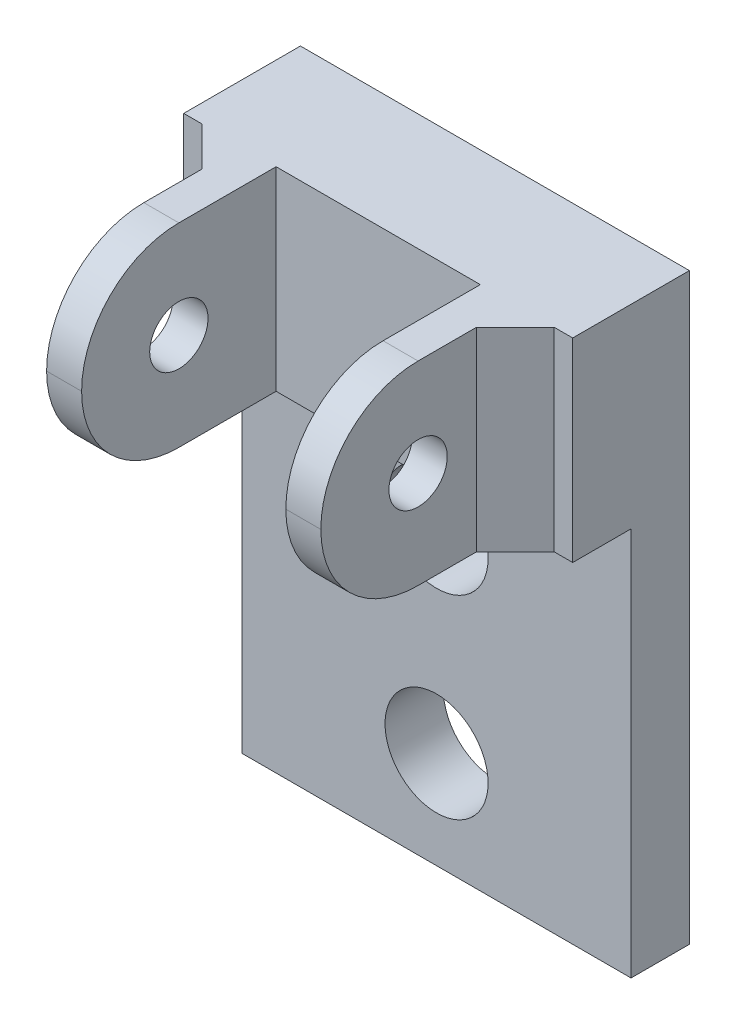
ISO-10303-21;
HEADER;
FILE_DESCRIPTION(('STEP AP214'),'2;1');
FILE_NAME('part.step','',(''),(''),'','','');
FILE_SCHEMA(('AUTOMOTIVE_DESIGN { 1 0 10303 214 1 1 1 1 }'));
ENDSEC;
DATA;
#1=APPLICATION_CONTEXT('core data for automotive mechanical design processes');
#2=APPLICATION_PROTOCOL_DEFINITION('international standard','automotive_design',2000,#1);
#3=PRODUCT_CONTEXT('',#1,'mechanical');
#4=PRODUCT('Part','Part','',(#3));
#5=PRODUCT_RELATED_PRODUCT_CATEGORY('part','',(#4));
#6=PRODUCT_DEFINITION_FORMATION('','',#4);
#7=PRODUCT_DEFINITION_CONTEXT('part definition',#1,'design');
#8=PRODUCT_DEFINITION('design','',#6,#7);
#9=PRODUCT_DEFINITION_SHAPE('','',#8);
#10=(LENGTH_UNIT() NAMED_UNIT(*) SI_UNIT(.MILLI.,.METRE.));
#11=(NAMED_UNIT(*) PLANE_ANGLE_UNIT() SI_UNIT($,.RADIAN.));
#12=(NAMED_UNIT(*) SI_UNIT($,.STERADIAN.) SOLID_ANGLE_UNIT());
#13=UNCERTAINTY_MEASURE_WITH_UNIT(LENGTH_MEASURE(1.E-05),#10,'distance_accuracy_value','');
#14=(GEOMETRIC_REPRESENTATION_CONTEXT(3) GLOBAL_UNCERTAINTY_ASSIGNED_CONTEXT((#13)) GLOBAL_UNIT_ASSIGNED_CONTEXT((#10,
#11,#12)) REPRESENTATION_CONTEXT('',''));
#15=CARTESIAN_POINT('',(0.,0.,0.));
#16=DIRECTION('',(0.,0.,1.));
#17=DIRECTION('',(1.,0.,0.));
#18=AXIS2_PLACEMENT_3D('',#15,#16,#17);
#19=CARTESIAN_POINT('',(0.,0.,6.));
#20=DIRECTION('',(0.,0.,1.));
#21=DIRECTION('',(1.,0.,0.));
#22=AXIS2_PLACEMENT_3D('',#19,#20,#21);
#23=PLANE('',#22);
#24=DIRECTION('',(1.,0.,0.));
#25=VECTOR('',#24,1.);
#26=CARTESIAN_POINT('',(-10.,5.,6.));
#27=LINE('',#26,#25);
#28=CARTESIAN_POINT('',(-5.25,5.,6.));
#29=VERTEX_POINT('',#28);
#30=CARTESIAN_POINT('',(5.25,5.,6.));
#31=VERTEX_POINT('',#30);
#32=EDGE_CURVE('E199',#29,#31,#27,.T.);
#33=ORIENTED_EDGE('',*,*,#32,.T.);
#34=DIRECTION('',(0.,-1.,0.));
#35=VECTOR('',#34,1.);
#36=CARTESIAN_POINT('',(5.25,15.,6.));
#37=LINE('',#36,#35);
#38=CARTESIAN_POINT('',(5.25,15.,6.));
#39=VERTEX_POINT('',#38);
#40=EDGE_CURVE('E177',#39,#31,#37,.T.);
#41=ORIENTED_EDGE('',*,*,#40,.F.);
#42=DIRECTION('',(-1.,0.,0.));
#43=VECTOR('',#42,1.);
#44=CARTESIAN_POINT('',(-10.,15.,6.));
#45=LINE('',#44,#43);
#46=CARTESIAN_POINT('',(-5.25,15.,6.));
#47=VERTEX_POINT('',#46);
#48=EDGE_CURVE('E186',#39,#47,#45,.T.);
#49=ORIENTED_EDGE('',*,*,#48,.T.);
#50=DIRECTION('',(0.,1.,0.));
#51=VECTOR('',#50,1.);
#52=CARTESIAN_POINT('',(-5.25,15.,6.));
#53=LINE('',#52,#51);
#54=EDGE_CURVE('E201',#29,#47,#53,.T.);
#55=ORIENTED_EDGE('',*,*,#54,.F.);
#56=EDGE_LOOP('',(#33,#41,#49,#55));
#57=FACE_BOUND('',#56,.T.);
#58=ADVANCED_FACE('F47',(#57),#23,.T.);
#59=CARTESIAN_POINT('',(10.,15.,6.));
#60=VERTEX_POINT('',#59);
#61=CARTESIAN_POINT('',(9.05,15.,6.));
#62=VERTEX_POINT('',#61);
#63=EDGE_CURVE('E194',#60,#62,#45,.T.);
#64=ORIENTED_EDGE('',*,*,#63,.T.);
#65=DIRECTION('',(0.,-1.,0.));
#66=VECTOR('',#65,1.);
#67=CARTESIAN_POINT('',(9.05,0.,6.));
#68=LINE('',#67,#66);
#69=CARTESIAN_POINT('',(9.05,5.,6.));
#70=VERTEX_POINT('',#69);
#71=EDGE_CURVE('E350',#62,#70,#68,.T.);
#72=ORIENTED_EDGE('',*,*,#71,.T.);
#73=CARTESIAN_POINT('',(10.,5.,6.));
#74=VERTEX_POINT('',#73);
#75=EDGE_CURVE('E224',#70,#74,#27,.T.);
#76=ORIENTED_EDGE('',*,*,#75,.T.);
#77=DIRECTION('',(0.,1.,0.));
#78=VECTOR('',#77,1.);
#79=CARTESIAN_POINT('',(10.,15.,6.));
#80=LINE('',#79,#78);
#81=EDGE_CURVE('E228',#74,#60,#80,.T.);
#82=ORIENTED_EDGE('',*,*,#81,.T.);
#83=EDGE_LOOP('',(#64,#72,#76,#82));
#84=FACE_BOUND('',#83,.T.);
#85=ADVANCED_FACE('F371',(#84),#23,.T.);
#86=CARTESIAN_POINT('',(-10.,5.,6.));
#87=VERTEX_POINT('',#86);
#88=CARTESIAN_POINT('',(-9.04999999999999,5.,6.));
#89=VERTEX_POINT('',#88);
#90=EDGE_CURVE('E225',#87,#89,#27,.T.);
#91=ORIENTED_EDGE('',*,*,#90,.T.);
#92=DIRECTION('',(0.,1.,0.));
#93=VECTOR('',#92,1.);
#94=CARTESIAN_POINT('',(-9.04999999999999,0.,6.));
#95=LINE('',#94,#93);
#96=CARTESIAN_POINT('',(-9.04999999999999,15.,6.));
#97=VERTEX_POINT('',#96);
#98=EDGE_CURVE('E70',#89,#97,#95,.T.);
#99=ORIENTED_EDGE('',*,*,#98,.T.);
#100=CARTESIAN_POINT('',(-10.,15.,6.));
#101=VERTEX_POINT('',#100);
#102=EDGE_CURVE('E195',#97,#101,#45,.T.);
#103=ORIENTED_EDGE('',*,*,#102,.T.);
#104=DIRECTION('',(0.,-1.,0.));
#105=VECTOR('',#104,1.);
#106=CARTESIAN_POINT('',(-10.,15.,6.));
#107=LINE('',#106,#105);
#108=EDGE_CURVE('E220',#101,#87,#107,.T.);
#109=ORIENTED_EDGE('',*,*,#108,.T.);
#110=EDGE_LOOP('',(#91,#99,#103,#109));
#111=FACE_BOUND('',#110,.T.);
#112=ADVANCED_FACE('F452',(#111),#23,.T.);
#113=CARTESIAN_POINT('',(0.,0.,3.));
#114=DIRECTION('',(0.,0.,1.));
#115=DIRECTION('',(1.,0.,0.));
#116=AXIS2_PLACEMENT_3D('',#113,#114,#115);
#117=PLANE('',#116);
#118=DIRECTION('',(1.,0.,0.));
#119=VECTOR('',#118,1.);
#120=CARTESIAN_POINT('',(-10.,5.,3.));
#121=LINE('',#120,#119);
#122=CARTESIAN_POINT('',(-10.,5.,3.));
#123=VERTEX_POINT('',#122);
#124=CARTESIAN_POINT('',(10.,5.,3.));
#125=VERTEX_POINT('',#124);
#126=EDGE_CURVE('E219',#123,#125,#121,.T.);
#127=ORIENTED_EDGE('',*,*,#126,.F.);
#128=DIRECTION('',(0.,-1.,0.));
#129=VECTOR('',#128,1.);
#130=CARTESIAN_POINT('',(-10.,-15.,3.));
#131=LINE('',#130,#129);
#132=CARTESIAN_POINT('',(-10.,-15.,3.));
#133=VERTEX_POINT('',#132);
#134=EDGE_CURVE('E262',#123,#133,#131,.T.);
#135=ORIENTED_EDGE('',*,*,#134,.T.);
#136=DIRECTION('',(1.,0.,0.));
#137=VECTOR('',#136,1.);
#138=CARTESIAN_POINT('',(10.,-15.,3.));
#139=LINE('',#138,#137);
#140=CARTESIAN_POINT('',(10.,-15.,3.));
#141=VERTEX_POINT('',#140);
#142=EDGE_CURVE('E265',#133,#141,#139,.T.);
#143=ORIENTED_EDGE('',*,*,#142,.T.);
#144=DIRECTION('',(0.,1.,0.));
#145=VECTOR('',#144,1.);
#146=CARTESIAN_POINT('',(10.,-15.,3.));
#147=LINE('',#146,#145);
#148=EDGE_CURVE('E269',#141,#125,#147,.T.);
#149=ORIENTED_EDGE('',*,*,#148,.T.);
#150=EDGE_LOOP('',(#127,#135,#143,#149));
#151=FACE_BOUND('',#150,.T.);
#152=CARTESIAN_POINT('',(0.,-10.,3.));
#153=DIRECTION('',(0.,0.,1.));
#154=DIRECTION('',(1.,0.,0.));
#155=AXIS2_PLACEMENT_3D('',#152,#153,#154);
#156=CIRCLE('',#155,2.65);
#157=CARTESIAN_POINT('',(2.65,-10.,3.));
#158=VERTEX_POINT('',#157);
#159=EDGE_CURVE('E254',#158,#158,#156,.T.);
#160=ORIENTED_EDGE('',*,*,#159,.F.);
#161=EDGE_LOOP('',(#160));
#162=FACE_BOUND('',#161,.T.);
#163=CARTESIAN_POINT('',(0.,0.,3.));
#164=DIRECTION('',(0.,0.,1.));
#165=DIRECTION('',(1.,0.,0.));
#166=AXIS2_PLACEMENT_3D('',#163,#164,#165);
#167=CIRCLE('',#166,2.65);
#168=CARTESIAN_POINT('',(2.65,0.,3.));
#169=VERTEX_POINT('',#168);
#170=EDGE_CURVE('E246',#169,#169,#167,.T.);
#171=ORIENTED_EDGE('',*,*,#170,.F.);
#172=EDGE_LOOP('',(#171));
#173=FACE_BOUND('',#172,.T.);
#174=ADVANCED_FACE('F461',(#151,#162,#173),#117,.T.);
#175=CARTESIAN_POINT('',(0.,0.,0.));
#176=DIRECTION('',(0.,0.,1.));
#177=DIRECTION('',(1.,0.,0.));
#178=AXIS2_PLACEMENT_3D('',#175,#176,#177);
#179=PLANE('',#178);
#180=DIRECTION('',(0.,-1.,0.));
#181=VECTOR('',#180,1.);
#182=CARTESIAN_POINT('',(-10.,-15.,0.));
#183=LINE('',#182,#181);
#184=CARTESIAN_POINT('',(-10.,15.,0.));
#185=VERTEX_POINT('',#184);
#186=CARTESIAN_POINT('',(-10.,-15.,0.));
#187=VERTEX_POINT('',#186);
#188=EDGE_CURVE('E258',#185,#187,#183,.T.);
#189=ORIENTED_EDGE('',*,*,#188,.F.);
#190=DIRECTION('',(-1.,0.,0.));
#191=VECTOR('',#190,1.);
#192=CARTESIAN_POINT('',(10.,15.,0.));
#193=LINE('',#192,#191);
#194=CARTESIAN_POINT('',(10.,15.,0.));
#195=VERTEX_POINT('',#194);
#196=EDGE_CURVE('E266',#195,#185,#193,.T.);
#197=ORIENTED_EDGE('',*,*,#196,.F.);
#198=DIRECTION('',(0.,1.,0.));
#199=VECTOR('',#198,1.);
#200=CARTESIAN_POINT('',(10.,-15.,0.));
#201=LINE('',#200,#199);
#202=CARTESIAN_POINT('',(10.,-15.,0.));
#203=VERTEX_POINT('',#202);
#204=EDGE_CURVE('E279',#203,#195,#201,.T.);
#205=ORIENTED_EDGE('',*,*,#204,.F.);
#206=DIRECTION('',(1.,0.,0.));
#207=VECTOR('',#206,1.);
#208=CARTESIAN_POINT('',(10.,-15.,0.));
#209=LINE('',#208,#207);
#210=EDGE_CURVE('E276',#187,#203,#209,.T.);
#211=ORIENTED_EDGE('',*,*,#210,.F.);
#212=EDGE_LOOP('',(#189,#197,#205,#211));
#213=FACE_BOUND('',#212,.T.);
#214=CARTESIAN_POINT('',(0.,-10.,0.));
#215=DIRECTION('',(0.,0.,1.));
#216=DIRECTION('',(1.,0.,0.));
#217=AXIS2_PLACEMENT_3D('',#214,#215,#216);
#218=CIRCLE('',#217,2.65);
#219=CARTESIAN_POINT('',(2.65,-10.,0.));
#220=VERTEX_POINT('',#219);
#221=EDGE_CURVE('E250',#220,#220,#218,.T.);
#222=ORIENTED_EDGE('',*,*,#221,.T.);
#223=EDGE_LOOP('',(#222));
#224=FACE_BOUND('',#223,.T.);
#225=CARTESIAN_POINT('',(0.,0.,0.));
#226=DIRECTION('',(0.,0.,1.));
#227=DIRECTION('',(1.,0.,0.));
#228=AXIS2_PLACEMENT_3D('',#225,#226,#227);
#229=CIRCLE('',#228,2.65);
#230=CARTESIAN_POINT('',(2.65,0.,0.));
#231=VERTEX_POINT('',#230);
#232=EDGE_CURVE('E245',#231,#231,#229,.T.);
#233=ORIENTED_EDGE('',*,*,#232,.T.);
#234=EDGE_LOOP('',(#233));
#235=FACE_BOUND('',#234,.T.);
#236=ADVANCED_FACE('F386',(#213,#224,#235),#179,.F.);
#237=CARTESIAN_POINT('',(-10.,-15.,3.));
#238=DIRECTION('',(1.,0.,0.));
#239=DIRECTION('',(0.,0.,-1.));
#240=AXIS2_PLACEMENT_3D('',#237,#238,#239);
#241=PLANE('',#240);
#242=ORIENTED_EDGE('',*,*,#188,.T.);
#243=DIRECTION('',(0.,0.,-1.));
#244=VECTOR('',#243,1.);
#245=CARTESIAN_POINT('',(-10.,-15.,3.));
#246=LINE('',#245,#244);
#247=EDGE_CURVE('E295',#133,#187,#246,.T.);
#248=ORIENTED_EDGE('',*,*,#247,.F.);
#249=ORIENTED_EDGE('',*,*,#134,.F.);
#250=DIRECTION('',(0.,0.,-1.));
#251=VECTOR('',#250,1.);
#252=CARTESIAN_POINT('',(-10.,5.,6.));
#253=LINE('',#252,#251);
#254=EDGE_CURVE('E241',#87,#123,#253,.T.);
#255=ORIENTED_EDGE('',*,*,#254,.F.);
#256=ORIENTED_EDGE('',*,*,#108,.F.);
#257=DIRECTION('',(0.,0.,-1.));
#258=VECTOR('',#257,1.);
#259=CARTESIAN_POINT('',(-10.,15.,3.));
#260=LINE('',#259,#258);
#261=EDGE_CURVE('E272',#101,#185,#260,.T.);
#262=ORIENTED_EDGE('',*,*,#261,.T.);
#263=EDGE_LOOP('',(#242,#248,#249,#255,#256,#262));
#264=FACE_BOUND('',#263,.T.);
#265=ADVANCED_FACE('F390',(#264),#241,.F.);
#266=CARTESIAN_POINT('',(10.,-15.,3.));
#267=DIRECTION('',(0.,1.,0.));
#268=DIRECTION('',(-1.,0.,0.));
#269=AXIS2_PLACEMENT_3D('',#266,#267,#268);
#270=PLANE('',#269);
#271=ORIENTED_EDGE('',*,*,#210,.T.);
#272=DIRECTION('',(0.,0.,-1.));
#273=VECTOR('',#272,1.);
#274=CARTESIAN_POINT('',(10.,-15.,3.));
#275=LINE('',#274,#273);
#276=EDGE_CURVE('E291',#141,#203,#275,.T.);
#277=ORIENTED_EDGE('',*,*,#276,.F.);
#278=ORIENTED_EDGE('',*,*,#142,.F.);
#279=ORIENTED_EDGE('',*,*,#247,.T.);
#280=EDGE_LOOP('',(#271,#277,#278,#279));
#281=FACE_BOUND('',#280,.T.);
#282=ADVANCED_FACE('F472',(#281),#270,.F.);
#283=CARTESIAN_POINT('',(10.,-15.,3.));
#284=DIRECTION('',(-1.,0.,0.));
#285=DIRECTION('',(0.,0.,1.));
#286=AXIS2_PLACEMENT_3D('',#283,#284,#285);
#287=PLANE('',#286);
#288=ORIENTED_EDGE('',*,*,#204,.T.);
#289=DIRECTION('',(0.,0.,-1.));
#290=VECTOR('',#289,1.);
#291=CARTESIAN_POINT('',(10.,15.,3.));
#292=LINE('',#291,#290);
#293=EDGE_CURVE('E287',#60,#195,#292,.T.);
#294=ORIENTED_EDGE('',*,*,#293,.F.);
#295=ORIENTED_EDGE('',*,*,#81,.F.);
#296=DIRECTION('',(0.,0.,-1.));
#297=VECTOR('',#296,1.);
#298=CARTESIAN_POINT('',(10.,5.,6.));
#299=LINE('',#298,#297);
#300=EDGE_CURVE('E234',#74,#125,#299,.T.);
#301=ORIENTED_EDGE('',*,*,#300,.T.);
#302=ORIENTED_EDGE('',*,*,#148,.F.);
#303=ORIENTED_EDGE('',*,*,#276,.T.);
#304=EDGE_LOOP('',(#288,#294,#295,#301,#302,#303));
#305=FACE_BOUND('',#304,.T.);
#306=ADVANCED_FACE('F380',(#305),#287,.F.);
#307=CARTESIAN_POINT('',(10.,15.,3.));
#308=DIRECTION('',(0.,-1.,0.));
#309=DIRECTION('',(1.,0.,0.));
#310=AXIS2_PLACEMENT_3D('',#307,#308,#309);
#311=PLANE('',#310);
#312=DIRECTION('',(0.,0.,-1.));
#313=VECTOR('',#312,1.);
#314=CARTESIAN_POINT('',(5.25,15.,16.));
#315=LINE('',#314,#313);
#316=CARTESIAN_POINT('',(5.25,15.,11.));
#317=VERTEX_POINT('',#316);
#318=EDGE_CURVE('E172',#317,#39,#315,.T.);
#319=ORIENTED_EDGE('',*,*,#318,.F.);
#320=DIRECTION('',(-1.,0.,0.));
#321=VECTOR('',#320,1.);
#322=CARTESIAN_POINT('',(7.05,15.,11.));
#323=LINE('',#322,#321);
#324=CARTESIAN_POINT('',(7.05,15.,11.));
#325=VERTEX_POINT('',#324);
#326=EDGE_CURVE('E333',#317,#325,#323,.F.);
#327=ORIENTED_EDGE('',*,*,#326,.T.);
#328=DIRECTION('',(0.,0.,-1.));
#329=VECTOR('',#328,1.);
#330=CARTESIAN_POINT('',(7.05,15.,16.));
#331=LINE('',#330,#329);
#332=CARTESIAN_POINT('',(7.05,15.,8.00000000000002));
#333=VERTEX_POINT('',#332);
#334=EDGE_CURVE('E183',#325,#333,#331,.T.);
#335=ORIENTED_EDGE('',*,*,#334,.T.);
#336=DIRECTION('',(0.707106781186544,0.,-0.707106781186551));
#337=VECTOR('',#336,1.);
#338=CARTESIAN_POINT('',(11.025,15.,4.02499999999998));
#339=LINE('',#338,#337);
#340=EDGE_CURVE('E359',#333,#62,#339,.T.);
#341=ORIENTED_EDGE('',*,*,#340,.T.);
#342=ORIENTED_EDGE('',*,*,#63,.F.);
#343=ORIENTED_EDGE('',*,*,#293,.T.);
#344=ORIENTED_EDGE('',*,*,#196,.T.);
#345=ORIENTED_EDGE('',*,*,#261,.F.);
#346=ORIENTED_EDGE('',*,*,#102,.F.);
#347=DIRECTION('',(0.707106781186543,0.,0.707106781186552));
#348=VECTOR('',#347,1.);
#349=CARTESIAN_POINT('',(-1.02500000000011,15.,14.025));
#350=LINE('',#349,#348);
#351=CARTESIAN_POINT('',(-7.05,15.,8.00000000000002));
#352=VERTEX_POINT('',#351);
#353=EDGE_CURVE('E11',#97,#352,#350,.T.);
#354=ORIENTED_EDGE('',*,*,#353,.T.);
#355=DIRECTION('',(0.,0.,-1.));
#356=VECTOR('',#355,1.);
#357=CARTESIAN_POINT('',(-7.05,15.,16.));
#358=LINE('',#357,#356);
#359=CARTESIAN_POINT('',(-7.05,15.,11.));
#360=VERTEX_POINT('',#359);
#361=EDGE_CURVE('E204',#360,#352,#358,.T.);
#362=ORIENTED_EDGE('',*,*,#361,.F.);
#363=DIRECTION('',(-1.,0.,0.));
#364=VECTOR('',#363,1.);
#365=CARTESIAN_POINT('',(-5.25,15.,11.));
#366=LINE('',#365,#364);
#367=CARTESIAN_POINT('',(-5.25,15.,11.));
#368=VERTEX_POINT('',#367);
#369=EDGE_CURVE('E330',#360,#368,#366,.F.);
#370=ORIENTED_EDGE('',*,*,#369,.T.);
#371=DIRECTION('',(0.,0.,-1.));
#372=VECTOR('',#371,1.);
#373=CARTESIAN_POINT('',(-5.25,15.,16.));
#374=LINE('',#373,#372);
#375=EDGE_CURVE('E189',#368,#47,#374,.T.);
#376=ORIENTED_EDGE('',*,*,#375,.T.);
#377=ORIENTED_EDGE('',*,*,#48,.F.);
#378=EDGE_LOOP('',(#319,#327,#335,#341,#342,#343,#344,#345,#346,#354,#362,#370,#376,#377));
#379=FACE_BOUND('',#378,.T.);
#380=ADVANCED_FACE('F187',(#379),#311,.F.);
#381=CARTESIAN_POINT('',(0.,-10.,3.));
#382=DIRECTION('',(0.,0.,-1.));
#383=DIRECTION('',(-1.,0.,0.));
#384=AXIS2_PLACEMENT_3D('',#381,#382,#383);
#385=CYLINDRICAL_SURFACE('',#384,2.65);
#386=ORIENTED_EDGE('',*,*,#159,.T.);
#387=EDGE_LOOP('',(#386));
#388=FACE_BOUND('',#387,.T.);
#389=ORIENTED_EDGE('',*,*,#221,.F.);
#390=EDGE_LOOP('',(#389));
#391=FACE_BOUND('',#390,.T.);
#392=ADVANCED_FACE('F594',(#388,#391),#385,.F.);
#393=CARTESIAN_POINT('',(0.,0.,3.));
#394=DIRECTION('',(0.,0.,-1.));
#395=DIRECTION('',(-1.,0.,0.));
#396=AXIS2_PLACEMENT_3D('',#393,#394,#395);
#397=CYLINDRICAL_SURFACE('',#396,2.65);
#398=ORIENTED_EDGE('',*,*,#170,.T.);
#399=EDGE_LOOP('',(#398));
#400=FACE_BOUND('',#399,.T.);
#401=ORIENTED_EDGE('',*,*,#232,.F.);
#402=EDGE_LOOP('',(#401));
#403=FACE_BOUND('',#402,.T.);
#404=ADVANCED_FACE('F588',(#400,#403),#397,.F.);
#405=CARTESIAN_POINT('',(-10.,5.,6.));
#406=DIRECTION('',(0.,1.,0.));
#407=DIRECTION('',(-1.,0.,0.));
#408=AXIS2_PLACEMENT_3D('',#405,#406,#407);
#409=PLANE('',#408);
#410=DIRECTION('',(0.,0.,-1.));
#411=VECTOR('',#410,1.);
#412=CARTESIAN_POINT('',(7.05,5.,16.));
#413=LINE('',#412,#411);
#414=CARTESIAN_POINT('',(7.05,5.,11.));
#415=VERTEX_POINT('',#414);
#416=CARTESIAN_POINT('',(7.05,5.,8.00000000000002));
#417=VERTEX_POINT('',#416);
#418=EDGE_CURVE('E416',#415,#417,#413,.T.);
#419=ORIENTED_EDGE('',*,*,#418,.F.);
#420=DIRECTION('',(1.,0.,0.));
#421=VECTOR('',#420,1.);
#422=CARTESIAN_POINT('',(5.25,5.,11.));
#423=LINE('',#422,#421);
#424=CARTESIAN_POINT('',(5.25,5.,11.));
#425=VERTEX_POINT('',#424);
#426=EDGE_CURVE('E309',#415,#425,#423,.F.);
#427=ORIENTED_EDGE('',*,*,#426,.T.);
#428=DIRECTION('',(0.,0.,-1.));
#429=VECTOR('',#428,1.);
#430=CARTESIAN_POINT('',(5.25,5.,16.));
#431=LINE('',#430,#429);
#432=EDGE_CURVE('E341',#425,#31,#431,.T.);
#433=ORIENTED_EDGE('',*,*,#432,.T.);
#434=ORIENTED_EDGE('',*,*,#32,.F.);
#435=DIRECTION('',(0.,0.,-1.));
#436=VECTOR('',#435,1.);
#437=CARTESIAN_POINT('',(-5.25,5.,16.));
#438=LINE('',#437,#436);
#439=CARTESIAN_POINT('',(-5.25,5.,11.));
#440=VERTEX_POINT('',#439);
#441=EDGE_CURVE('E213',#440,#29,#438,.T.);
#442=ORIENTED_EDGE('',*,*,#441,.F.);
#443=DIRECTION('',(1.,0.,0.));
#444=VECTOR('',#443,1.);
#445=CARTESIAN_POINT('',(-7.05,5.,11.));
#446=LINE('',#445,#444);
#447=CARTESIAN_POINT('',(-7.05,5.,11.));
#448=VERTEX_POINT('',#447);
#449=EDGE_CURVE('E305',#440,#448,#446,.F.);
#450=ORIENTED_EDGE('',*,*,#449,.T.);
#451=DIRECTION('',(0.,0.,-1.));
#452=VECTOR('',#451,1.);
#453=CARTESIAN_POINT('',(-7.05,5.,16.));
#454=LINE('',#453,#452);
#455=CARTESIAN_POINT('',(-7.05,5.,8.00000000000002));
#456=VERTEX_POINT('',#455);
#457=EDGE_CURVE('E216',#448,#456,#454,.T.);
#458=ORIENTED_EDGE('',*,*,#457,.T.);
#459=DIRECTION('',(-0.707106781186543,0.,-0.707106781186552));
#460=VECTOR('',#459,1.);
#461=CARTESIAN_POINT('',(-9.52499999999999,5.,5.525));
#462=LINE('',#461,#460);
#463=EDGE_CURVE('E57',#456,#89,#462,.T.);
#464=ORIENTED_EDGE('',*,*,#463,.T.);
#465=ORIENTED_EDGE('',*,*,#90,.F.);
#466=ORIENTED_EDGE('',*,*,#254,.T.);
#467=ORIENTED_EDGE('',*,*,#126,.T.);
#468=ORIENTED_EDGE('',*,*,#300,.F.);
#469=ORIENTED_EDGE('',*,*,#75,.F.);
#470=DIRECTION('',(-0.707106781186544,0.,0.707106781186551));
#471=VECTOR('',#470,1.);
#472=CARTESIAN_POINT('',(-0.474999999999899,5.,15.525));
#473=LINE('',#472,#471);
#474=EDGE_CURVE('E362',#70,#417,#473,.T.);
#475=ORIENTED_EDGE('',*,*,#474,.T.);
#476=EDGE_LOOP('',(#419,#427,#433,#434,#442,#450,#458,#464,#465,#466,#467,#468,#469,#475));
#477=FACE_BOUND('',#476,.T.);
#478=ADVANCED_FACE('F377',(#477),#409,.F.);
#479=CARTESIAN_POINT('',(-7.05,15.,16.));
#480=DIRECTION('',(1.,0.,0.));
#481=DIRECTION('',(0.,0.,-1.));
#482=AXIS2_PLACEMENT_3D('',#479,#480,#481);
#483=PLANE('',#482);
#484=CARTESIAN_POINT('',(-7.05,10.,11.));
#485=DIRECTION('',(-1.,0.,0.));
#486=DIRECTION('',(0.,0.,1.));
#487=AXIS2_PLACEMENT_3D('',#484,#485,#486);
#488=CIRCLE('',#487,1.5);
#489=CARTESIAN_POINT('',(-7.05,10.,12.5));
#490=VERTEX_POINT('',#489);
#491=EDGE_CURVE('E680',#490,#490,#488,.T.);
#492=ORIENTED_EDGE('',*,*,#491,.F.);
#493=EDGE_LOOP('',(#492));
#494=FACE_BOUND('',#493,.T.);
#495=ORIENTED_EDGE('',*,*,#361,.T.);
#496=DIRECTION('',(0.,-1.,0.));
#497=VECTOR('',#496,1.);
#498=CARTESIAN_POINT('',(-7.05,15.,8.00000000000002));
#499=LINE('',#498,#497);
#500=EDGE_CURVE('E353',#352,#456,#499,.T.);
#501=ORIENTED_EDGE('',*,*,#500,.T.);
#502=ORIENTED_EDGE('',*,*,#457,.F.);
#503=CARTESIAN_POINT('',(-7.05,10.,11.));
#504=DIRECTION('',(1.,0.,0.));
#505=DIRECTION('',(0.,0.,-1.));
#506=AXIS2_PLACEMENT_3D('',#503,#504,#505);
#507=CIRCLE('',#506,5.);
#508=CARTESIAN_POINT('',(-7.05,10.,16.));
#509=VERTEX_POINT('',#508);
#510=EDGE_CURVE('E327',#448,#509,#507,.F.);
#511=ORIENTED_EDGE('',*,*,#510,.T.);
#512=CARTESIAN_POINT('',(-7.05,10.,11.));
#513=DIRECTION('',(1.,0.,0.));
#514=DIRECTION('',(0.,0.,-1.));
#515=AXIS2_PLACEMENT_3D('',#512,#513,#514);
#516=CIRCLE('',#515,5.);
#517=EDGE_CURVE('E324',#509,#360,#516,.F.);
#518=ORIENTED_EDGE('',*,*,#517,.T.);
#519=EDGE_LOOP('',(#495,#501,#502,#511,#518));
#520=FACE_BOUND('',#519,.T.);
#521=ADVANCED_FACE('F400',(#494,#520),#483,.F.);
#522=CARTESIAN_POINT('',(-5.25,15.,16.));
#523=DIRECTION('',(-1.,0.,0.));
#524=DIRECTION('',(0.,-1.,0.));
#525=AXIS2_PLACEMENT_3D('',#522,#523,#524);
#526=PLANE('',#525);
#527=CARTESIAN_POINT('',(-5.25,10.,11.));
#528=DIRECTION('',(-1.,0.,0.));
#529=DIRECTION('',(0.,-1.,0.));
#530=AXIS2_PLACEMENT_3D('',#527,#528,#529);
#531=CIRCLE('',#530,1.5);
#532=CARTESIAN_POINT('',(-5.25,8.5,11.));
#533=VERTEX_POINT('',#532);
#534=EDGE_CURVE('E346',#533,#533,#531,.T.);
#535=ORIENTED_EDGE('',*,*,#534,.T.);
#536=EDGE_LOOP('',(#535));
#537=FACE_BOUND('',#536,.T.);
#538=CARTESIAN_POINT('',(-5.25,10.,11.));
#539=DIRECTION('',(-1.,0.,0.));
#540=DIRECTION('',(0.,-1.,0.));
#541=AXIS2_PLACEMENT_3D('',#538,#539,#540);
#542=CIRCLE('',#541,5.);
#543=CARTESIAN_POINT('',(-5.25,10.,16.));
#544=VERTEX_POINT('',#543);
#545=EDGE_CURVE('E318',#368,#544,#542,.F.);
#546=ORIENTED_EDGE('',*,*,#545,.T.);
#547=CARTESIAN_POINT('',(-5.25,10.,11.));
#548=DIRECTION('',(-1.,0.,0.));
#549=DIRECTION('',(0.,-1.,0.));
#550=AXIS2_PLACEMENT_3D('',#547,#548,#549);
#551=CIRCLE('',#550,5.);
#552=EDGE_CURVE('E321',#544,#440,#551,.F.);
#553=ORIENTED_EDGE('',*,*,#552,.T.);
#554=ORIENTED_EDGE('',*,*,#441,.T.);
#555=ORIENTED_EDGE('',*,*,#54,.T.);
#556=ORIENTED_EDGE('',*,*,#375,.F.);
#557=EDGE_LOOP('',(#546,#553,#554,#555,#556));
#558=FACE_BOUND('',#557,.T.);
#559=ADVANCED_FACE('F413',(#537,#558),#526,.F.);
#560=CARTESIAN_POINT('',(5.25,15.,16.));
#561=DIRECTION('',(1.,0.,0.));
#562=DIRECTION('',(0.,1.,0.));
#563=AXIS2_PLACEMENT_3D('',#560,#561,#562);
#564=PLANE('',#563);
#565=CARTESIAN_POINT('',(5.25,10.,11.));
#566=DIRECTION('',(1.,0.,0.));
#567=DIRECTION('',(0.,1.,0.));
#568=AXIS2_PLACEMENT_3D('',#565,#566,#567);
#569=CIRCLE('',#568,1.5);
#570=CARTESIAN_POINT('',(5.25,11.5,11.));
#571=VERTEX_POINT('',#570);
#572=EDGE_CURVE('E679',#571,#571,#569,.T.);
#573=ORIENTED_EDGE('',*,*,#572,.T.);
#574=EDGE_LOOP('',(#573));
#575=FACE_BOUND('',#574,.T.);
#576=ORIENTED_EDGE('',*,*,#432,.F.);
#577=CARTESIAN_POINT('',(5.25,10.,11.));
#578=DIRECTION('',(1.,0.,0.));
#579=DIRECTION('',(0.,1.,0.));
#580=AXIS2_PLACEMENT_3D('',#577,#578,#579);
#581=CIRCLE('',#580,5.);
#582=CARTESIAN_POINT('',(5.25,10.,16.));
#583=VERTEX_POINT('',#582);
#584=EDGE_CURVE('E315',#425,#583,#581,.F.);
#585=ORIENTED_EDGE('',*,*,#584,.T.);
#586=CARTESIAN_POINT('',(5.25,10.,11.));
#587=DIRECTION('',(1.,0.,0.));
#588=DIRECTION('',(0.,1.,0.));
#589=AXIS2_PLACEMENT_3D('',#586,#587,#588);
#590=CIRCLE('',#589,5.);
#591=EDGE_CURVE('E179',#583,#317,#590,.F.);
#592=ORIENTED_EDGE('',*,*,#591,.T.);
#593=ORIENTED_EDGE('',*,*,#318,.T.);
#594=ORIENTED_EDGE('',*,*,#40,.T.);
#595=EDGE_LOOP('',(#576,#585,#592,#593,#594));
#596=FACE_BOUND('',#595,.T.);
#597=ADVANCED_FACE('F175',(#575,#596),#564,.F.);
#598=CARTESIAN_POINT('',(7.05,15.,16.));
#599=DIRECTION('',(-1.,0.,0.));
#600=DIRECTION('',(0.,-1.,0.));
#601=AXIS2_PLACEMENT_3D('',#598,#599,#600);
#602=PLANE('',#601);
#603=CARTESIAN_POINT('',(7.05,10.,11.));
#604=DIRECTION('',(-1.,0.,0.));
#605=DIRECTION('',(0.,-1.,0.));
#606=AXIS2_PLACEMENT_3D('',#603,#604,#605);
#607=CIRCLE('',#606,1.5);
#608=CARTESIAN_POINT('',(7.05,8.5,11.));
#609=VERTEX_POINT('',#608);
#610=EDGE_CURVE('E677',#609,#609,#607,.F.);
#611=ORIENTED_EDGE('',*,*,#610,.F.);
#612=EDGE_LOOP('',(#611));
#613=FACE_BOUND('',#612,.T.);
#614=ORIENTED_EDGE('',*,*,#418,.T.);
#615=DIRECTION('',(0.,1.,0.));
#616=VECTOR('',#615,1.);
#617=CARTESIAN_POINT('',(7.05,15.,8.00000000000002));
#618=LINE('',#617,#616);
#619=EDGE_CURVE('E336',#417,#333,#618,.T.);
#620=ORIENTED_EDGE('',*,*,#619,.T.);
#621=ORIENTED_EDGE('',*,*,#334,.F.);
#622=CARTESIAN_POINT('',(7.05,10.,11.));
#623=DIRECTION('',(-1.,0.,0.));
#624=DIRECTION('',(0.,-1.,0.));
#625=AXIS2_PLACEMENT_3D('',#622,#623,#624);
#626=CIRCLE('',#625,5.);
#627=CARTESIAN_POINT('',(7.05,10.,16.));
#628=VERTEX_POINT('',#627);
#629=EDGE_CURVE('E299',#325,#628,#626,.F.);
#630=ORIENTED_EDGE('',*,*,#629,.T.);
#631=CARTESIAN_POINT('',(7.05,10.,11.));
#632=DIRECTION('',(-1.,0.,0.));
#633=DIRECTION('',(0.,-1.,0.));
#634=AXIS2_PLACEMENT_3D('',#631,#632,#633);
#635=CIRCLE('',#634,5.);
#636=EDGE_CURVE('E302',#628,#415,#635,.F.);
#637=ORIENTED_EDGE('',*,*,#636,.T.);
#638=EDGE_LOOP('',(#614,#620,#621,#630,#637));
#639=FACE_BOUND('',#638,.T.);
#640=ADVANCED_FACE('F428',(#613,#639),#602,.F.);
#641=CARTESIAN_POINT('',(0.,10.,11.));
#642=DIRECTION('',(1.,0.,0.));
#643=DIRECTION('',(0.,1.,0.));
#644=AXIS2_PLACEMENT_3D('',#641,#642,#643);
#645=CYLINDRICAL_SURFACE('',#644,5.);
#646=ORIENTED_EDGE('',*,*,#326,.F.);
#647=ORIENTED_EDGE('',*,*,#591,.F.);
#648=DIRECTION('',(-1.,0.,0.));
#649=VECTOR('',#648,1.);
#650=CARTESIAN_POINT('',(5.25,10.,16.));
#651=LINE('',#650,#649);
#652=EDGE_CURVE('E337',#628,#583,#651,.T.);
#653=ORIENTED_EDGE('',*,*,#652,.F.);
#654=ORIENTED_EDGE('',*,*,#629,.F.);
#655=EDGE_LOOP('',(#646,#647,#653,#654));
#656=FACE_BOUND('',#655,.T.);
#657=ADVANCED_FACE('F432',(#656),#645,.T.);
#658=CARTESIAN_POINT('',(0.,10.,11.));
#659=DIRECTION('',(-1.,0.,0.));
#660=DIRECTION('',(0.,-1.,0.));
#661=AXIS2_PLACEMENT_3D('',#658,#659,#660);
#662=CYLINDRICAL_SURFACE('',#661,5.);
#663=ORIENTED_EDGE('',*,*,#584,.F.);
#664=ORIENTED_EDGE('',*,*,#426,.F.);
#665=ORIENTED_EDGE('',*,*,#636,.F.);
#666=ORIENTED_EDGE('',*,*,#652,.T.);
#667=EDGE_LOOP('',(#663,#664,#665,#666));
#668=FACE_BOUND('',#667,.T.);
#669=ADVANCED_FACE('F435',(#668),#662,.T.);
#670=CARTESIAN_POINT('',(0.,10.,11.));
#671=DIRECTION('',(1.,0.,0.));
#672=DIRECTION('',(0.,1.,0.));
#673=AXIS2_PLACEMENT_3D('',#670,#671,#672);
#674=CYLINDRICAL_SURFACE('',#673,5.);
#675=ORIENTED_EDGE('',*,*,#369,.F.);
#676=ORIENTED_EDGE('',*,*,#517,.F.);
#677=DIRECTION('',(-1.,0.,0.));
#678=VECTOR('',#677,1.);
#679=CARTESIAN_POINT('',(-7.05,10.,16.));
#680=LINE('',#679,#678);
#681=EDGE_CURVE('E342',#544,#509,#680,.T.);
#682=ORIENTED_EDGE('',*,*,#681,.F.);
#683=ORIENTED_EDGE('',*,*,#545,.F.);
#684=EDGE_LOOP('',(#675,#676,#682,#683));
#685=FACE_BOUND('',#684,.T.);
#686=ADVANCED_FACE('F410',(#685),#674,.T.);
#687=CARTESIAN_POINT('',(0.,10.,11.));
#688=DIRECTION('',(-1.,0.,0.));
#689=DIRECTION('',(0.,-1.,0.));
#690=AXIS2_PLACEMENT_3D('',#687,#688,#689);
#691=CYLINDRICAL_SURFACE('',#690,5.);
#692=ORIENTED_EDGE('',*,*,#510,.F.);
#693=ORIENTED_EDGE('',*,*,#449,.F.);
#694=ORIENTED_EDGE('',*,*,#552,.F.);
#695=ORIENTED_EDGE('',*,*,#681,.T.);
#696=EDGE_LOOP('',(#692,#693,#694,#695));
#697=FACE_BOUND('',#696,.T.);
#698=ADVANCED_FACE('F405',(#697),#691,.T.);
#699=CARTESIAN_POINT('',(11.2926406871193,10.,11.));
#700=DIRECTION('',(-1.,0.,0.));
#701=DIRECTION('',(0.,0.,1.));
#702=AXIS2_PLACEMENT_3D('',#699,#700,#701);
#703=CYLINDRICAL_SURFACE('',#702,1.5);
#704=ORIENTED_EDGE('',*,*,#610,.T.);
#705=EDGE_LOOP('',(#704));
#706=FACE_BOUND('',#705,.T.);
#707=ORIENTED_EDGE('',*,*,#572,.F.);
#708=EDGE_LOOP('',(#707));
#709=FACE_BOUND('',#708,.T.);
#710=ADVANCED_FACE('F445',(#706,#709),#703,.F.);
#711=ORIENTED_EDGE('',*,*,#491,.T.);
#712=EDGE_LOOP('',(#711));
#713=FACE_BOUND('',#712,.T.);
#714=ORIENTED_EDGE('',*,*,#534,.F.);
#715=EDGE_LOOP('',(#714));
#716=FACE_BOUND('',#715,.T.);
#717=ADVANCED_FACE('F439',(#713,#716),#703,.F.);
#718=CARTESIAN_POINT('',(7.05,15.,8.00000000000002));
#719=DIRECTION('',(-0.707106781186551,0.,-0.707106781186544));
#720=DIRECTION('',(0.,1.,0.));
#721=AXIS2_PLACEMENT_3D('',#718,#719,#720);
#722=PLANE('',#721);
#723=ORIENTED_EDGE('',*,*,#474,.F.);
#724=ORIENTED_EDGE('',*,*,#71,.F.);
#725=ORIENTED_EDGE('',*,*,#340,.F.);
#726=ORIENTED_EDGE('',*,*,#619,.F.);
#727=EDGE_LOOP('',(#723,#724,#725,#726));
#728=FACE_BOUND('',#727,.T.);
#729=ADVANCED_FACE('F437',(#728),#722,.F.);
#730=CARTESIAN_POINT('',(-7.05,15.,8.00000000000002));
#731=DIRECTION('',(0.707106781186552,0.,-0.707106781186543));
#732=DIRECTION('',(0.,-1.,0.));
#733=AXIS2_PLACEMENT_3D('',#730,#731,#732);
#734=PLANE('',#733);
#735=ORIENTED_EDGE('',*,*,#353,.F.);
#736=ORIENTED_EDGE('',*,*,#98,.F.);
#737=ORIENTED_EDGE('',*,*,#463,.F.);
#738=ORIENTED_EDGE('',*,*,#500,.F.);
#739=EDGE_LOOP('',(#735,#736,#737,#738));
#740=FACE_BOUND('',#739,.T.);
#741=ADVANCED_FACE('F50',(#740),#734,.F.);
#742=CLOSED_SHELL('',(#58,#85,#112,#174,#236,#265,#282,#306,#380,#392,#404,#478,#521,#559,#597,
#640,#657,#669,#686,#698,#710,#717,#729,#741));
#743=MANIFOLD_SOLID_BREP('B2',#742);
#744=ADVANCED_BREP_SHAPE_REPRESENTATION('',(#18,#743),#14);
#745=SHAPE_DEFINITION_REPRESENTATION(#9,#744);
ENDSEC;
END-ISO-10303-21;
